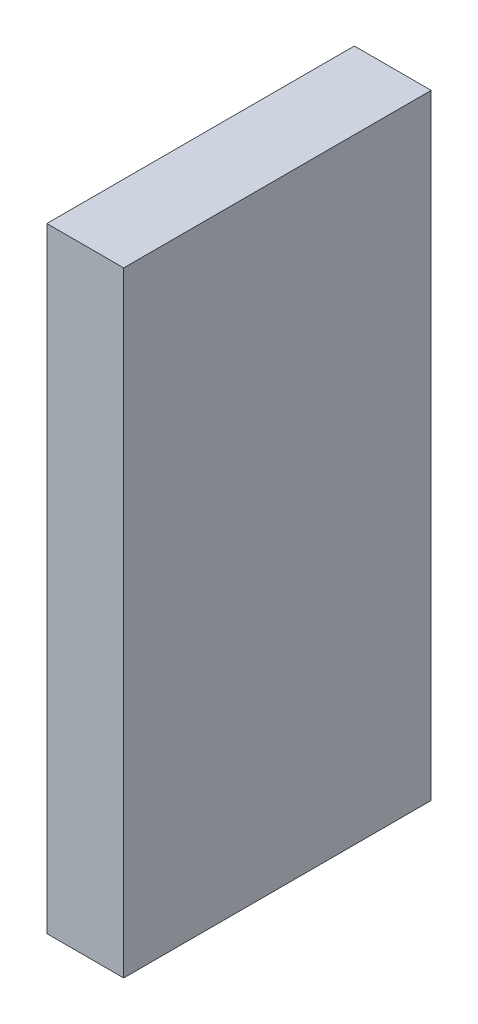
ISO-10303-21;
HEADER;
FILE_DESCRIPTION(('STEP AP214'),'2;1');
FILE_NAME('part.step','',(''),(''),'','','');
FILE_SCHEMA(('AUTOMOTIVE_DESIGN { 1 0 10303 214 1 1 1 1 }'));
ENDSEC;
DATA;
#1=APPLICATION_CONTEXT('core data for automotive mechanical design processes');
#2=APPLICATION_PROTOCOL_DEFINITION('international standard','automotive_design',2000,#1);
#3=PRODUCT_CONTEXT('',#1,'mechanical');
#4=PRODUCT('Part','Part','',(#3));
#5=PRODUCT_RELATED_PRODUCT_CATEGORY('part','',(#4));
#6=PRODUCT_DEFINITION_FORMATION('','',#4);
#7=PRODUCT_DEFINITION_CONTEXT('part definition',#1,'design');
#8=PRODUCT_DEFINITION('design','',#6,#7);
#9=PRODUCT_DEFINITION_SHAPE('','',#8);
#10=(LENGTH_UNIT() NAMED_UNIT(*) SI_UNIT(.MILLI.,.METRE.));
#11=(NAMED_UNIT(*) PLANE_ANGLE_UNIT() SI_UNIT($,.RADIAN.));
#12=(NAMED_UNIT(*) SI_UNIT($,.STERADIAN.) SOLID_ANGLE_UNIT());
#13=UNCERTAINTY_MEASURE_WITH_UNIT(LENGTH_MEASURE(1.E-05),#10,'distance_accuracy_value','');
#14=(GEOMETRIC_REPRESENTATION_CONTEXT(3) GLOBAL_UNCERTAINTY_ASSIGNED_CONTEXT((#13)) GLOBAL_UNIT_ASSIGNED_CONTEXT((#10,
#11,#12)) REPRESENTATION_CONTEXT('',''));
#15=CARTESIAN_POINT('',(0.,0.,0.));
#16=DIRECTION('',(0.,0.,1.));
#17=DIRECTION('',(1.,0.,0.));
#18=AXIS2_PLACEMENT_3D('',#15,#16,#17);
#19=CARTESIAN_POINT('',(3.175,25.4,-12.7));
#20=DIRECTION('',(0.,0.,1.));
#21=DIRECTION('',(1.,0.,0.));
#22=AXIS2_PLACEMENT_3D('',#19,#20,#21);
#23=PLANE('',#22);
#24=DIRECTION('',(0.,1.,0.));
#25=VECTOR('',#24,1.);
#26=CARTESIAN_POINT('',(-3.175,25.4,-12.7));
#27=LINE('',#26,#25);
#28=CARTESIAN_POINT('',(-3.175,-25.4,-12.7));
#29=VERTEX_POINT('',#28);
#30=CARTESIAN_POINT('',(-3.175,25.4,-12.7));
#31=VERTEX_POINT('',#30);
#32=EDGE_CURVE('E96',#29,#31,#27,.T.);
#33=ORIENTED_EDGE('',*,*,#32,.T.);
#34=DIRECTION('',(-1.,0.,0.));
#35=VECTOR('',#34,1.);
#36=CARTESIAN_POINT('',(3.175,25.4,-12.7));
#37=LINE('',#36,#35);
#38=CARTESIAN_POINT('',(3.175,25.4,-12.7));
#39=VERTEX_POINT('',#38);
#40=EDGE_CURVE('E11',#39,#31,#37,.T.);
#41=ORIENTED_EDGE('',*,*,#40,.F.);
#42=DIRECTION('',(0.,1.,0.));
#43=VECTOR('',#42,1.);
#44=CARTESIAN_POINT('',(3.175,25.4,-12.7));
#45=LINE('',#44,#43);
#46=CARTESIAN_POINT('',(3.175,-25.4,-12.7));
#47=VERTEX_POINT('',#46);
#48=EDGE_CURVE('E84',#47,#39,#45,.T.);
#49=ORIENTED_EDGE('',*,*,#48,.F.);
#50=DIRECTION('',(-1.,0.,0.));
#51=VECTOR('',#50,1.);
#52=CARTESIAN_POINT('',(3.175,-25.4,-12.7));
#53=LINE('',#52,#51);
#54=EDGE_CURVE('E92',#47,#29,#53,.T.);
#55=ORIENTED_EDGE('',*,*,#54,.T.);
#56=EDGE_LOOP('',(#33,#41,#49,#55));
#57=FACE_BOUND('',#56,.T.);
#58=ADVANCED_FACE('F33',(#57),#23,.F.);
#59=CARTESIAN_POINT('',(3.175,25.4,12.7));
#60=DIRECTION('',(0.,-1.,0.));
#61=DIRECTION('',(0.,0.,-1.));
#62=AXIS2_PLACEMENT_3D('',#59,#60,#61);
#63=PLANE('',#62);
#64=DIRECTION('',(0.,0.,1.));
#65=VECTOR('',#64,1.);
#66=CARTESIAN_POINT('',(-3.175,25.4,12.7));
#67=LINE('',#66,#65);
#68=CARTESIAN_POINT('',(-3.175,25.4,12.7));
#69=VERTEX_POINT('',#68);
#70=EDGE_CURVE('E88',#31,#69,#67,.T.);
#71=ORIENTED_EDGE('',*,*,#70,.T.);
#72=DIRECTION('',(-1.,0.,0.));
#73=VECTOR('',#72,1.);
#74=CARTESIAN_POINT('',(3.175,25.4,12.7));
#75=LINE('',#74,#73);
#76=CARTESIAN_POINT('',(3.175,25.4,12.7));
#77=VERTEX_POINT('',#76);
#78=EDGE_CURVE('E41',#77,#69,#75,.T.);
#79=ORIENTED_EDGE('',*,*,#78,.F.);
#80=DIRECTION('',(0.,0.,1.));
#81=VECTOR('',#80,1.);
#82=CARTESIAN_POINT('',(3.175,25.4,12.7));
#83=LINE('',#82,#81);
#84=EDGE_CURVE('E79',#39,#77,#83,.T.);
#85=ORIENTED_EDGE('',*,*,#84,.F.);
#86=ORIENTED_EDGE('',*,*,#40,.T.);
#87=EDGE_LOOP('',(#71,#79,#85,#86));
#88=FACE_BOUND('',#87,.T.);
#89=ADVANCED_FACE('F87',(#88),#63,.F.);
#90=CARTESIAN_POINT('',(3.175,25.4,12.7));
#91=DIRECTION('',(0.,0.,-1.));
#92=DIRECTION('',(-1.,0.,0.));
#93=AXIS2_PLACEMENT_3D('',#90,#91,#92);
#94=PLANE('',#93);
#95=DIRECTION('',(0.,-1.,0.));
#96=VECTOR('',#95,1.);
#97=CARTESIAN_POINT('',(-3.175,25.4,12.7));
#98=LINE('',#97,#96);
#99=CARTESIAN_POINT('',(-3.175,-25.4,12.7));
#100=VERTEX_POINT('',#99);
#101=EDGE_CURVE('E66',#69,#100,#98,.T.);
#102=ORIENTED_EDGE('',*,*,#101,.T.);
#103=DIRECTION('',(-1.,0.,0.));
#104=VECTOR('',#103,1.);
#105=CARTESIAN_POINT('',(3.175,-25.4,12.7));
#106=LINE('',#105,#104);
#107=CARTESIAN_POINT('',(3.175,-25.4,12.7));
#108=VERTEX_POINT('',#107);
#109=EDGE_CURVE('E89',#108,#100,#106,.T.);
#110=ORIENTED_EDGE('',*,*,#109,.F.);
#111=DIRECTION('',(0.,-1.,0.));
#112=VECTOR('',#111,1.);
#113=CARTESIAN_POINT('',(3.175,25.4,12.7));
#114=LINE('',#113,#112);
#115=EDGE_CURVE('E82',#77,#108,#114,.T.);
#116=ORIENTED_EDGE('',*,*,#115,.F.);
#117=ORIENTED_EDGE('',*,*,#78,.T.);
#118=EDGE_LOOP('',(#102,#110,#116,#117));
#119=FACE_BOUND('',#118,.T.);
#120=ADVANCED_FACE('F90',(#119),#94,.F.);
#121=CARTESIAN_POINT('',(3.175,-25.4,12.7));
#122=DIRECTION('',(0.,1.,0.));
#123=DIRECTION('',(0.,0.,1.));
#124=AXIS2_PLACEMENT_3D('',#121,#122,#123);
#125=PLANE('',#124);
#126=DIRECTION('',(0.,0.,-1.));
#127=VECTOR('',#126,1.);
#128=CARTESIAN_POINT('',(-3.175,-25.4,12.7));
#129=LINE('',#128,#127);
#130=EDGE_CURVE('E72',#100,#29,#129,.T.);
#131=ORIENTED_EDGE('',*,*,#130,.T.);
#132=ORIENTED_EDGE('',*,*,#54,.F.);
#133=DIRECTION('',(0.,0.,-1.));
#134=VECTOR('',#133,1.);
#135=CARTESIAN_POINT('',(3.175,-25.4,12.7));
#136=LINE('',#135,#134);
#137=EDGE_CURVE('E49',#108,#47,#136,.T.);
#138=ORIENTED_EDGE('',*,*,#137,.F.);
#139=ORIENTED_EDGE('',*,*,#109,.T.);
#140=EDGE_LOOP('',(#131,#132,#138,#139));
#141=FACE_BOUND('',#140,.T.);
#142=ADVANCED_FACE('F103',(#141),#125,.F.);
#143=CARTESIAN_POINT('',(3.175,0.,0.));
#144=DIRECTION('',(1.,0.,0.));
#145=DIRECTION('',(0.,0.,-1.));
#146=AXIS2_PLACEMENT_3D('',#143,#144,#145);
#147=PLANE('',#146);
#148=ORIENTED_EDGE('',*,*,#48,.T.);
#149=ORIENTED_EDGE('',*,*,#84,.T.);
#150=ORIENTED_EDGE('',*,*,#115,.T.);
#151=ORIENTED_EDGE('',*,*,#137,.T.);
#152=EDGE_LOOP('',(#148,#149,#150,#151));
#153=FACE_BOUND('',#152,.T.);
#154=ADVANCED_FACE('F80',(#153),#147,.T.);
#155=CARTESIAN_POINT('',(-3.175,0.,0.));
#156=DIRECTION('',(1.,0.,0.));
#157=DIRECTION('',(0.,0.,-1.));
#158=AXIS2_PLACEMENT_3D('',#155,#156,#157);
#159=PLANE('',#158);
#160=ORIENTED_EDGE('',*,*,#32,.F.);
#161=ORIENTED_EDGE('',*,*,#130,.F.);
#162=ORIENTED_EDGE('',*,*,#101,.F.);
#163=ORIENTED_EDGE('',*,*,#70,.F.);
#164=EDGE_LOOP('',(#160,#161,#162,#163));
#165=FACE_BOUND('',#164,.T.);
#166=ADVANCED_FACE('F106',(#165),#159,.F.);
#167=CLOSED_SHELL('',(#58,#89,#120,#142,#154,#166));
#168=MANIFOLD_SOLID_BREP('B2',#167);
#169=ADVANCED_BREP_SHAPE_REPRESENTATION('',(#18,#168),#14);
#170=SHAPE_DEFINITION_REPRESENTATION(#9,#169);
ENDSEC;
END-ISO-10303-21;
